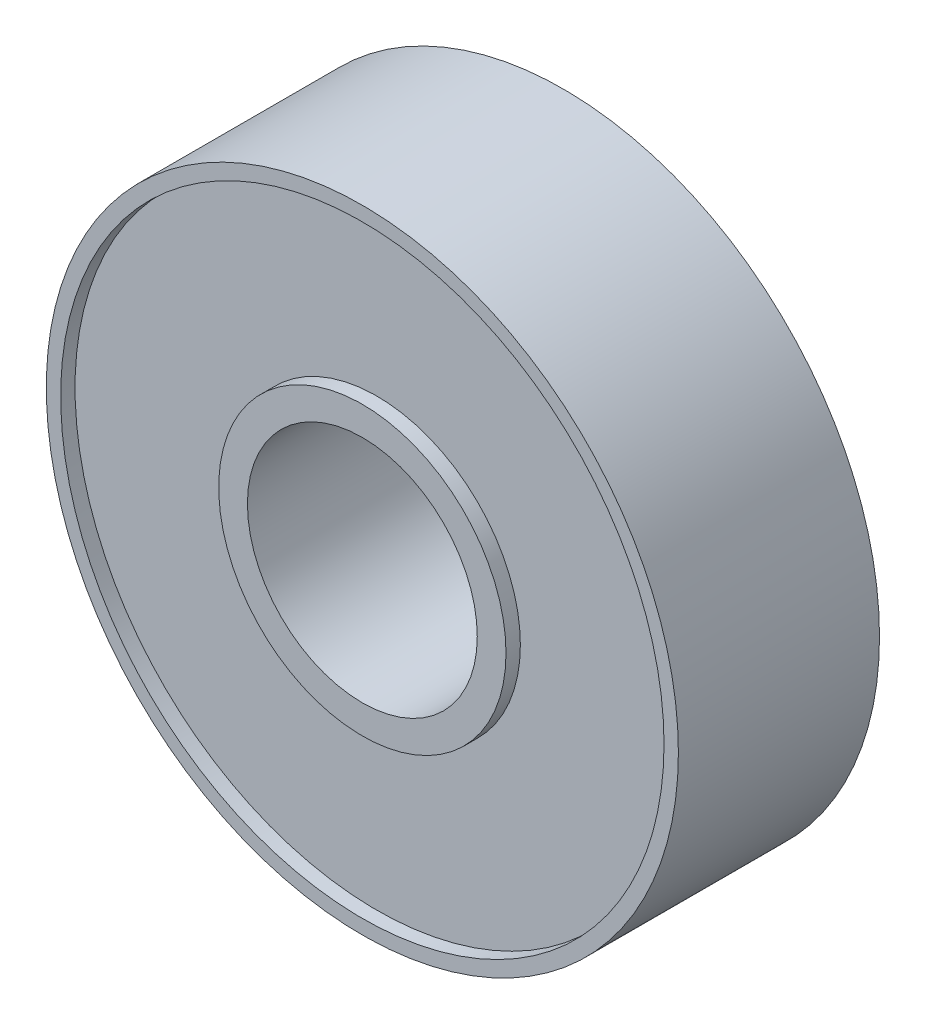
ISO-10303-21;
HEADER;
FILE_DESCRIPTION(('STEP AP214'),'2;1');
FILE_NAME('part.step','',(''),(''),'','','');
FILE_SCHEMA(('AUTOMOTIVE_DESIGN { 1 0 10303 214 1 1 1 1 }'));
ENDSEC;
DATA;
#1=APPLICATION_CONTEXT('core data for automotive mechanical design processes');
#2=APPLICATION_PROTOCOL_DEFINITION('international standard','automotive_design',2000,#1);
#3=PRODUCT_CONTEXT('',#1,'mechanical');
#4=PRODUCT('Part','Part','',(#3));
#5=PRODUCT_RELATED_PRODUCT_CATEGORY('part','',(#4));
#6=PRODUCT_DEFINITION_FORMATION('','',#4);
#7=PRODUCT_DEFINITION_CONTEXT('part definition',#1,'design');
#8=PRODUCT_DEFINITION('design','',#6,#7);
#9=PRODUCT_DEFINITION_SHAPE('','',#8);
#10=(LENGTH_UNIT() NAMED_UNIT(*) SI_UNIT(.MILLI.,.METRE.));
#11=(NAMED_UNIT(*) PLANE_ANGLE_UNIT() SI_UNIT($,.RADIAN.));
#12=(NAMED_UNIT(*) SI_UNIT($,.STERADIAN.) SOLID_ANGLE_UNIT());
#13=UNCERTAINTY_MEASURE_WITH_UNIT(LENGTH_MEASURE(1.E-05),#10,'distance_accuracy_value','');
#14=(GEOMETRIC_REPRESENTATION_CONTEXT(3) GLOBAL_UNCERTAINTY_ASSIGNED_CONTEXT((#13)) GLOBAL_UNIT_ASSIGNED_CONTEXT((#10,
#11,#12)) REPRESENTATION_CONTEXT('',''));
#15=CARTESIAN_POINT('',(0.,0.,0.));
#16=DIRECTION('',(0.,0.,1.));
#17=DIRECTION('',(1.,0.,0.));
#18=AXIS2_PLACEMENT_3D('',#15,#16,#17);
#19=CARTESIAN_POINT('',(0.,0.,-3.5));
#20=DIRECTION('',(0.,0.,1.));
#21=DIRECTION('',(1.,0.,0.));
#22=AXIS2_PLACEMENT_3D('',#19,#20,#21);
#23=PLANE('',#22);
#24=CARTESIAN_POINT('',(0.,0.,-3.5));
#25=DIRECTION('',(0.,0.,1.));
#26=DIRECTION('',(1.,0.,0.));
#27=AXIS2_PLACEMENT_3D('',#24,#25,#26);
#28=CIRCLE('',#27,11.);
#29=CARTESIAN_POINT('',(11.,0.,-3.5));
#30=VERTEX_POINT('',#29);
#31=EDGE_CURVE('E34',#30,#30,#28,.T.);
#32=ORIENTED_EDGE('',*,*,#31,.F.);
#33=EDGE_LOOP('',(#32));
#34=FACE_BOUND('',#33,.T.);
#35=CARTESIAN_POINT('',(0.,0.,-3.5));
#36=DIRECTION('',(0.,0.,1.));
#37=DIRECTION('',(1.,0.,0.));
#38=AXIS2_PLACEMENT_3D('',#35,#36,#37);
#39=CIRCLE('',#38,10.5);
#40=CARTESIAN_POINT('',(10.5,0.,-3.5));
#41=VERTEX_POINT('',#40);
#42=EDGE_CURVE('E61',#41,#41,#39,.T.);
#43=ORIENTED_EDGE('',*,*,#42,.T.);
#44=EDGE_LOOP('',(#43));
#45=FACE_BOUND('',#44,.T.);
#46=ADVANCED_FACE('F30',(#34,#45),#23,.F.);
#47=CARTESIAN_POINT('',(0.,0.,3.5));
#48=DIRECTION('',(0.,0.,1.));
#49=DIRECTION('',(1.,0.,0.));
#50=AXIS2_PLACEMENT_3D('',#47,#48,#49);
#51=PLANE('',#50);
#52=CARTESIAN_POINT('',(0.,0.,3.5));
#53=DIRECTION('',(0.,0.,1.));
#54=DIRECTION('',(1.,0.,0.));
#55=AXIS2_PLACEMENT_3D('',#52,#53,#54);
#56=CIRCLE('',#55,4.);
#57=CARTESIAN_POINT('',(4.,0.,3.5));
#58=VERTEX_POINT('',#57);
#59=EDGE_CURVE('E41',#58,#58,#56,.T.);
#60=ORIENTED_EDGE('',*,*,#59,.F.);
#61=EDGE_LOOP('',(#60));
#62=FACE_BOUND('',#61,.T.);
#63=CARTESIAN_POINT('',(0.,0.,3.5));
#64=DIRECTION('',(0.,0.,1.));
#65=DIRECTION('',(1.,0.,0.));
#66=AXIS2_PLACEMENT_3D('',#63,#64,#65);
#67=CIRCLE('',#66,5.);
#68=CARTESIAN_POINT('',(5.,0.,3.5));
#69=VERTEX_POINT('',#68);
#70=EDGE_CURVE('E53',#69,#69,#67,.T.);
#71=ORIENTED_EDGE('',*,*,#70,.T.);
#72=EDGE_LOOP('',(#71));
#73=FACE_BOUND('',#72,.T.);
#74=ADVANCED_FACE('F105',(#62,#73),#51,.T.);
#75=CARTESIAN_POINT('',(0.,0.,3.5));
#76=DIRECTION('',(0.,0.,1.));
#77=DIRECTION('',(1.,0.,0.));
#78=AXIS2_PLACEMENT_3D('',#75,#76,#77);
#79=CIRCLE('',#78,10.5);
#80=CARTESIAN_POINT('',(10.5,0.,3.5));
#81=VERTEX_POINT('',#80);
#82=EDGE_CURVE('E49',#81,#81,#79,.T.);
#83=ORIENTED_EDGE('',*,*,#82,.F.);
#84=EDGE_LOOP('',(#83));
#85=FACE_BOUND('',#84,.T.);
#86=CARTESIAN_POINT('',(0.,0.,3.5));
#87=DIRECTION('',(0.,0.,1.));
#88=DIRECTION('',(1.,0.,0.));
#89=AXIS2_PLACEMENT_3D('',#86,#87,#88);
#90=CIRCLE('',#89,11.);
#91=CARTESIAN_POINT('',(11.,0.,3.5));
#92=VERTEX_POINT('',#91);
#93=EDGE_CURVE('E10',#92,#92,#90,.T.);
#94=ORIENTED_EDGE('',*,*,#93,.T.);
#95=EDGE_LOOP('',(#94));
#96=FACE_BOUND('',#95,.T.);
#97=ADVANCED_FACE('F87',(#85,#96),#51,.T.);
#98=CARTESIAN_POINT('',(0.,0.,-3.5));
#99=DIRECTION('',(0.,0.,1.));
#100=DIRECTION('',(1.,0.,0.));
#101=AXIS2_PLACEMENT_3D('',#98,#99,#100);
#102=CIRCLE('',#101,5.);
#103=CARTESIAN_POINT('',(5.,0.,-3.5));
#104=VERTEX_POINT('',#103);
#105=EDGE_CURVE('E65',#104,#104,#102,.T.);
#106=ORIENTED_EDGE('',*,*,#105,.F.);
#107=EDGE_LOOP('',(#106));
#108=FACE_BOUND('',#107,.T.);
#109=CARTESIAN_POINT('',(0.,0.,-3.5));
#110=DIRECTION('',(0.,0.,1.));
#111=DIRECTION('',(1.,0.,0.));
#112=AXIS2_PLACEMENT_3D('',#109,#110,#111);
#113=CIRCLE('',#112,4.);
#114=CARTESIAN_POINT('',(4.,0.,-3.5));
#115=VERTEX_POINT('',#114);
#116=EDGE_CURVE('E43',#115,#115,#113,.T.);
#117=ORIENTED_EDGE('',*,*,#116,.T.);
#118=EDGE_LOOP('',(#117));
#119=FACE_BOUND('',#118,.T.);
#120=ADVANCED_FACE('F84',(#108,#119),#23,.F.);
#121=CARTESIAN_POINT('',(0.,0.,3.5));
#122=DIRECTION('',(0.,0.,-1.));
#123=DIRECTION('',(-1.,0.,0.));
#124=AXIS2_PLACEMENT_3D('',#121,#122,#123);
#125=CYLINDRICAL_SURFACE('',#124,11.);
#126=ORIENTED_EDGE('',*,*,#93,.F.);
#127=EDGE_LOOP('',(#126));
#128=FACE_BOUND('',#127,.T.);
#129=ORIENTED_EDGE('',*,*,#31,.T.);
#130=EDGE_LOOP('',(#129));
#131=FACE_BOUND('',#130,.T.);
#132=ADVANCED_FACE('F32',(#128,#131),#125,.T.);
#133=CARTESIAN_POINT('',(0.,0.,3.5));
#134=DIRECTION('',(0.,0.,-1.));
#135=DIRECTION('',(-1.,0.,0.));
#136=AXIS2_PLACEMENT_3D('',#133,#134,#135);
#137=CYLINDRICAL_SURFACE('',#136,4.);
#138=ORIENTED_EDGE('',*,*,#59,.T.);
#139=EDGE_LOOP('',(#138));
#140=FACE_BOUND('',#139,.T.);
#141=ORIENTED_EDGE('',*,*,#116,.F.);
#142=EDGE_LOOP('',(#141));
#143=FACE_BOUND('',#142,.T.);
#144=ADVANCED_FACE('F90',(#140,#143),#137,.F.);
#145=CARTESIAN_POINT('',(0.,0.,3.));
#146=DIRECTION('',(0.,0.,1.));
#147=DIRECTION('',(1.,0.,0.));
#148=AXIS2_PLACEMENT_3D('',#145,#146,#147);
#149=CYLINDRICAL_SURFACE('',#148,5.);
#150=CARTESIAN_POINT('',(0.,0.,3.));
#151=DIRECTION('',(0.,0.,1.));
#152=DIRECTION('',(1.,0.,0.));
#153=AXIS2_PLACEMENT_3D('',#150,#151,#152);
#154=CIRCLE('',#153,5.);
#155=CARTESIAN_POINT('',(5.,0.,3.));
#156=VERTEX_POINT('',#155);
#157=EDGE_CURVE('E52',#156,#156,#154,.T.);
#158=ORIENTED_EDGE('',*,*,#157,.T.);
#159=EDGE_LOOP('',(#158));
#160=FACE_BOUND('',#159,.T.);
#161=ORIENTED_EDGE('',*,*,#70,.F.);
#162=EDGE_LOOP('',(#161));
#163=FACE_BOUND('',#162,.T.);
#164=ADVANCED_FACE('F92',(#160,#163),#149,.T.);
#165=CARTESIAN_POINT('',(0.,0.,3.));
#166=DIRECTION('',(0.,0.,1.));
#167=DIRECTION('',(1.,0.,0.));
#168=AXIS2_PLACEMENT_3D('',#165,#166,#167);
#169=CYLINDRICAL_SURFACE('',#168,10.5);
#170=CARTESIAN_POINT('',(0.,0.,3.));
#171=DIRECTION('',(0.,0.,1.));
#172=DIRECTION('',(1.,0.,0.));
#173=AXIS2_PLACEMENT_3D('',#170,#171,#172);
#174=CIRCLE('',#173,10.5);
#175=CARTESIAN_POINT('',(10.5,0.,3.));
#176=VERTEX_POINT('',#175);
#177=EDGE_CURVE('E46',#176,#176,#174,.T.);
#178=ORIENTED_EDGE('',*,*,#177,.F.);
#179=EDGE_LOOP('',(#178));
#180=FACE_BOUND('',#179,.T.);
#181=ORIENTED_EDGE('',*,*,#82,.T.);
#182=EDGE_LOOP('',(#181));
#183=FACE_BOUND('',#182,.T.);
#184=ADVANCED_FACE('F99',(#180,#183),#169,.F.);
#185=CARTESIAN_POINT('',(0.,0.,3.));
#186=DIRECTION('',(0.,0.,1.));
#187=DIRECTION('',(1.,0.,0.));
#188=AXIS2_PLACEMENT_3D('',#185,#186,#187);
#189=PLANE('',#188);
#190=ORIENTED_EDGE('',*,*,#157,.F.);
#191=EDGE_LOOP('',(#190));
#192=FACE_BOUND('',#191,.T.);
#193=ORIENTED_EDGE('',*,*,#177,.T.);
#194=EDGE_LOOP('',(#193));
#195=FACE_BOUND('',#194,.T.);
#196=ADVANCED_FACE('F80',(#192,#195),#189,.T.);
#197=CARTESIAN_POINT('',(0.,0.,-3.));
#198=DIRECTION('',(0.,0.,-1.));
#199=DIRECTION('',(-1.,0.,0.));
#200=AXIS2_PLACEMENT_3D('',#197,#198,#199);
#201=CYLINDRICAL_SURFACE('',#200,5.);
#202=CARTESIAN_POINT('',(0.,0.,-3.));
#203=DIRECTION('',(0.,0.,1.));
#204=DIRECTION('',(1.,0.,0.));
#205=AXIS2_PLACEMENT_3D('',#202,#203,#204);
#206=CIRCLE('',#205,5.);
#207=CARTESIAN_POINT('',(5.,0.,-3.));
#208=VERTEX_POINT('',#207);
#209=EDGE_CURVE('E64',#208,#208,#206,.T.);
#210=ORIENTED_EDGE('',*,*,#209,.F.);
#211=EDGE_LOOP('',(#210));
#212=FACE_BOUND('',#211,.T.);
#213=ORIENTED_EDGE('',*,*,#105,.T.);
#214=EDGE_LOOP('',(#213));
#215=FACE_BOUND('',#214,.T.);
#216=ADVANCED_FACE('F76',(#212,#215),#201,.T.);
#217=CARTESIAN_POINT('',(0.,0.,-3.));
#218=DIRECTION('',(0.,0.,-1.));
#219=DIRECTION('',(-1.,0.,0.));
#220=AXIS2_PLACEMENT_3D('',#217,#218,#219);
#221=CYLINDRICAL_SURFACE('',#220,10.5);
#222=CARTESIAN_POINT('',(0.,0.,-3.));
#223=DIRECTION('',(0.,0.,1.));
#224=DIRECTION('',(1.,0.,0.));
#225=AXIS2_PLACEMENT_3D('',#222,#223,#224);
#226=CIRCLE('',#225,10.5);
#227=CARTESIAN_POINT('',(10.5,0.,-3.));
#228=VERTEX_POINT('',#227);
#229=EDGE_CURVE('E56',#228,#228,#226,.T.);
#230=ORIENTED_EDGE('',*,*,#229,.T.);
#231=EDGE_LOOP('',(#230));
#232=FACE_BOUND('',#231,.T.);
#233=ORIENTED_EDGE('',*,*,#42,.F.);
#234=EDGE_LOOP('',(#233));
#235=FACE_BOUND('',#234,.T.);
#236=ADVANCED_FACE('F79',(#232,#235),#221,.F.);
#237=CARTESIAN_POINT('',(0.,0.,-3.));
#238=DIRECTION('',(0.,0.,-1.));
#239=DIRECTION('',(1.,0.,0.));
#240=AXIS2_PLACEMENT_3D('',#237,#238,#239);
#241=PLANE('',#240);
#242=ORIENTED_EDGE('',*,*,#209,.T.);
#243=EDGE_LOOP('',(#242));
#244=FACE_BOUND('',#243,.T.);
#245=ORIENTED_EDGE('',*,*,#229,.F.);
#246=EDGE_LOOP('',(#245));
#247=FACE_BOUND('',#246,.T.);
#248=ADVANCED_FACE('F73',(#244,#247),#241,.T.);
#249=CLOSED_SHELL('',(#46,#74,#97,#120,#132,#144,#164,#184,#196,#216,#236,#248));
#250=MANIFOLD_SOLID_BREP('B2',#249);
#251=ADVANCED_BREP_SHAPE_REPRESENTATION('',(#18,#250),#14);
#252=SHAPE_DEFINITION_REPRESENTATION(#9,#251);
ENDSEC;
END-ISO-10303-21;
